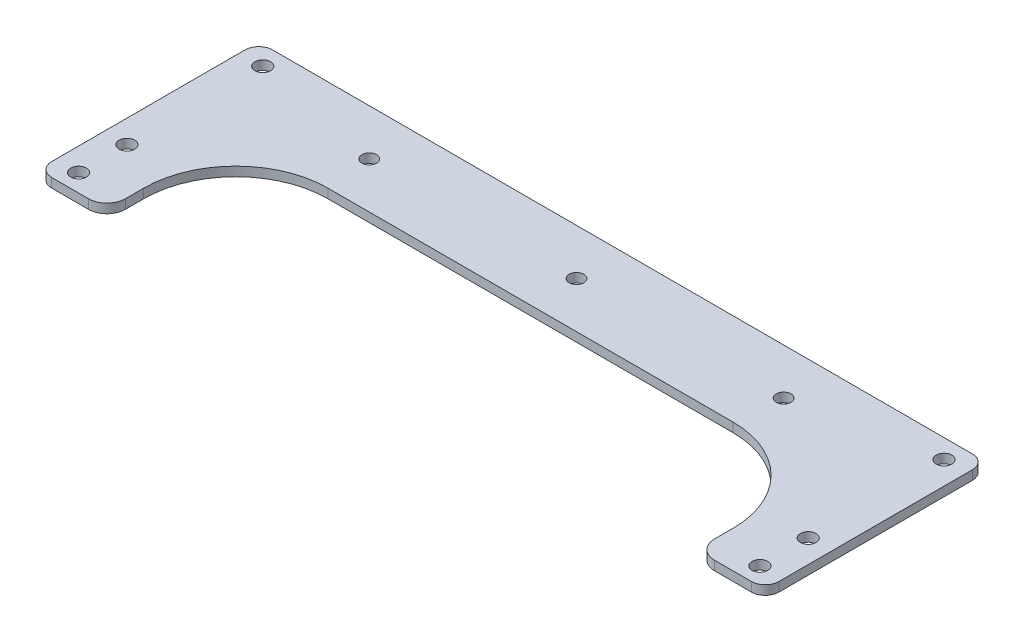
ISO-10303-21;
HEADER;
FILE_DESCRIPTION(('STEP AP214'),'2;1');
FILE_NAME('part.step','',(''),(''),'','','');
FILE_SCHEMA(('AUTOMOTIVE_DESIGN { 1 0 10303 214 1 1 1 1 }'));
ENDSEC;
DATA;
#1=APPLICATION_CONTEXT('core data for automotive mechanical design processes');
#2=APPLICATION_PROTOCOL_DEFINITION('international standard','automotive_design',2000,#1);
#3=PRODUCT_CONTEXT('',#1,'mechanical');
#4=PRODUCT('Part','Part','',(#3));
#5=PRODUCT_RELATED_PRODUCT_CATEGORY('part','',(#4));
#6=PRODUCT_DEFINITION_FORMATION('','',#4);
#7=PRODUCT_DEFINITION_CONTEXT('part definition',#1,'design');
#8=PRODUCT_DEFINITION('design','',#6,#7);
#9=PRODUCT_DEFINITION_SHAPE('','',#8);
#10=(LENGTH_UNIT() NAMED_UNIT(*) SI_UNIT(.MILLI.,.METRE.));
#11=(NAMED_UNIT(*) PLANE_ANGLE_UNIT() SI_UNIT($,.RADIAN.));
#12=(NAMED_UNIT(*) SI_UNIT($,.STERADIAN.) SOLID_ANGLE_UNIT());
#13=UNCERTAINTY_MEASURE_WITH_UNIT(LENGTH_MEASURE(1.E-05),#10,'distance_accuracy_value','');
#14=(GEOMETRIC_REPRESENTATION_CONTEXT(3) GLOBAL_UNCERTAINTY_ASSIGNED_CONTEXT((#13)) GLOBAL_UNIT_ASSIGNED_CONTEXT((#10,
#11,#12)) REPRESENTATION_CONTEXT('',''));
#15=CARTESIAN_POINT('',(0.,0.,0.));
#16=DIRECTION('',(0.,0.,1.));
#17=DIRECTION('',(1.,0.,0.));
#18=AXIS2_PLACEMENT_3D('',#15,#16,#17);
#19=CARTESIAN_POINT('',(0.,2.,0.));
#20=DIRECTION('',(0.,-1.,0.));
#21=DIRECTION('',(0.,0.,-1.));
#22=AXIS2_PLACEMENT_3D('',#19,#20,#21);
#23=PLANE('',#22);
#24=CARTESIAN_POINT('',(45.,2.,-14.));
#25=DIRECTION('',(0.,1.,0.));
#26=DIRECTION('',(0.,0.,1.));
#27=AXIS2_PLACEMENT_3D('',#24,#25,#26);
#28=CIRCLE('',#27,1.6);
#29=CARTESIAN_POINT('',(45.,2.,-12.4));
#30=VERTEX_POINT('',#29);
#31=EDGE_CURVE('E362',#30,#30,#28,.T.);
#32=ORIENTED_EDGE('',*,*,#31,.F.);
#33=EDGE_LOOP('',(#32));
#34=FACE_BOUND('',#33,.T.);
#35=CARTESIAN_POINT('',(-45.,2.,-14.));
#36=DIRECTION('',(0.,1.,0.));
#37=DIRECTION('',(0.,0.,1.));
#38=AXIS2_PLACEMENT_3D('',#35,#36,#37);
#39=CIRCLE('',#38,1.6);
#40=CARTESIAN_POINT('',(-45.,2.,-12.4));
#41=VERTEX_POINT('',#40);
#42=EDGE_CURVE('E356',#41,#41,#39,.T.);
#43=ORIENTED_EDGE('',*,*,#42,.F.);
#44=EDGE_LOOP('',(#43));
#45=FACE_BOUND('',#44,.T.);
#46=CARTESIAN_POINT('',(0.,2.,-14.));
#47=DIRECTION('',(0.,1.,0.));
#48=DIRECTION('',(0.,0.,1.));
#49=AXIS2_PLACEMENT_3D('',#46,#47,#48);
#50=CIRCLE('',#49,1.6);
#51=CARTESIAN_POINT('',(0.,2.,-12.4));
#52=VERTEX_POINT('',#51);
#53=EDGE_CURVE('E353',#52,#52,#50,.T.);
#54=ORIENTED_EDGE('',*,*,#53,.F.);
#55=EDGE_LOOP('',(#54));
#56=FACE_BOUND('',#55,.T.);
#57=CARTESIAN_POINT('',(-74.,2.,-19.85));
#58=DIRECTION('',(0.,1.,0.));
#59=DIRECTION('',(0.,0.,1.));
#60=AXIS2_PLACEMENT_3D('',#57,#58,#59);
#61=CIRCLE('',#60,1.7);
#62=CARTESIAN_POINT('',(-74.,2.,-18.15));
#63=VERTEX_POINT('',#62);
#64=EDGE_CURVE('E345',#63,#63,#61,.T.);
#65=ORIENTED_EDGE('',*,*,#64,.F.);
#66=EDGE_LOOP('',(#65));
#67=FACE_BOUND('',#66,.T.);
#68=CARTESIAN_POINT('',(-74.,2.,9.64999999999999));
#69=DIRECTION('',(0.,1.,0.));
#70=DIRECTION('',(0.,0.,1.));
#71=AXIS2_PLACEMENT_3D('',#68,#69,#70);
#72=CIRCLE('',#71,1.7);
#73=CARTESIAN_POINT('',(-74.,2.,11.35));
#74=VERTEX_POINT('',#73);
#75=EDGE_CURVE('E320',#74,#74,#72,.T.);
#76=ORIENTED_EDGE('',*,*,#75,.F.);
#77=EDGE_LOOP('',(#76));
#78=FACE_BOUND('',#77,.T.);
#79=CARTESIAN_POINT('',(-74.,2.,20.15));
#80=DIRECTION('',(0.,1.,0.));
#81=DIRECTION('',(0.,0.,1.));
#82=AXIS2_PLACEMENT_3D('',#79,#80,#81);
#83=CIRCLE('',#82,1.7);
#84=CARTESIAN_POINT('',(-74.,2.,21.85));
#85=VERTEX_POINT('',#84);
#86=EDGE_CURVE('E317',#85,#85,#83,.T.);
#87=ORIENTED_EDGE('',*,*,#86,.F.);
#88=EDGE_LOOP('',(#87));
#89=FACE_BOUND('',#88,.T.);
#90=DIRECTION('',(0.,0.,-1.));
#91=VECTOR('',#90,1.);
#92=CARTESIAN_POINT('',(64.,2.,0.));
#93=LINE('',#92,#91);
#94=CARTESIAN_POINT('',(64.,2.,20.));
#95=VERTEX_POINT('',#94);
#96=CARTESIAN_POINT('',(64.,2.,16.));
#97=VERTEX_POINT('',#96);
#98=EDGE_CURVE('E281',#95,#97,#93,.T.);
#99=ORIENTED_EDGE('',*,*,#98,.F.);
#100=CARTESIAN_POINT('',(68.,2.,20.));
#101=DIRECTION('',(0.,-1.,0.));
#102=DIRECTION('',(0.,0.,-1.));
#103=AXIS2_PLACEMENT_3D('',#100,#101,#102);
#104=CIRCLE('',#103,4.);
#105=CARTESIAN_POINT('',(68.,2.,24.));
#106=VERTEX_POINT('',#105);
#107=EDGE_CURVE('E232',#95,#106,#104,.F.);
#108=ORIENTED_EDGE('',*,*,#107,.T.);
#109=DIRECTION('',(1.,0.,0.));
#110=VECTOR('',#109,1.);
#111=CARTESIAN_POINT('',(-79.,2.,24.));
#112=LINE('',#111,#110);
#113=CARTESIAN_POINT('',(76.,2.,24.));
#114=VERTEX_POINT('',#113);
#115=EDGE_CURVE('E293',#106,#114,#112,.T.);
#116=ORIENTED_EDGE('',*,*,#115,.T.);
#117=CARTESIAN_POINT('',(76.,2.,21.));
#118=DIRECTION('',(0.,-1.,0.));
#119=DIRECTION('',(0.,0.,-1.));
#120=AXIS2_PLACEMENT_3D('',#117,#118,#119);
#121=CIRCLE('',#120,3.);
#122=CARTESIAN_POINT('',(79.,2.,21.));
#123=VERTEX_POINT('',#122);
#124=EDGE_CURVE('E212',#114,#123,#121,.F.);
#125=ORIENTED_EDGE('',*,*,#124,.T.);
#126=DIRECTION('',(0.,0.,-1.));
#127=VECTOR('',#126,1.);
#128=CARTESIAN_POINT('',(79.,2.,24.));
#129=LINE('',#128,#127);
#130=CARTESIAN_POINT('',(79.,2.,-21.));
#131=VERTEX_POINT('',#130);
#132=EDGE_CURVE('E198',#123,#131,#129,.T.);
#133=ORIENTED_EDGE('',*,*,#132,.T.);
#134=CARTESIAN_POINT('',(76.,2.,-21.));
#135=DIRECTION('',(0.,-1.,0.));
#136=DIRECTION('',(0.,0.,-1.));
#137=AXIS2_PLACEMENT_3D('',#134,#135,#136);
#138=CIRCLE('',#137,3.);
#139=CARTESIAN_POINT('',(76.,2.,-24.));
#140=VERTEX_POINT('',#139);
#141=EDGE_CURVE('E214',#131,#140,#138,.F.);
#142=ORIENTED_EDGE('',*,*,#141,.T.);
#143=DIRECTION('',(-1.,0.,0.));
#144=VECTOR('',#143,1.);
#145=CARTESIAN_POINT('',(-79.,2.,-24.));
#146=LINE('',#145,#144);
#147=CARTESIAN_POINT('',(-76.,2.,-24.));
#148=VERTEX_POINT('',#147);
#149=EDGE_CURVE('E176',#140,#148,#146,.T.);
#150=ORIENTED_EDGE('',*,*,#149,.T.);
#151=CARTESIAN_POINT('',(-76.,2.,-21.));
#152=DIRECTION('',(0.,-1.,0.));
#153=DIRECTION('',(0.,0.,-1.));
#154=AXIS2_PLACEMENT_3D('',#151,#152,#153);
#155=CIRCLE('',#154,3.);
#156=CARTESIAN_POINT('',(-79.,2.,-21.));
#157=VERTEX_POINT('',#156);
#158=EDGE_CURVE('E210',#148,#157,#155,.F.);
#159=ORIENTED_EDGE('',*,*,#158,.T.);
#160=DIRECTION('',(0.,0.,1.));
#161=VECTOR('',#160,1.);
#162=CARTESIAN_POINT('',(-79.,2.,24.));
#163=LINE('',#162,#161);
#164=CARTESIAN_POINT('',(-79.,2.,21.));
#165=VERTEX_POINT('',#164);
#166=EDGE_CURVE('E291',#157,#165,#163,.T.);
#167=ORIENTED_EDGE('',*,*,#166,.T.);
#168=CARTESIAN_POINT('',(-76.,2.,21.));
#169=DIRECTION('',(0.,-1.,0.));
#170=DIRECTION('',(0.,0.,-1.));
#171=AXIS2_PLACEMENT_3D('',#168,#169,#170);
#172=CIRCLE('',#171,3.);
#173=CARTESIAN_POINT('',(-76.,2.,24.));
#174=VERTEX_POINT('',#173);
#175=EDGE_CURVE('E208',#165,#174,#172,.F.);
#176=ORIENTED_EDGE('',*,*,#175,.T.);
#177=CARTESIAN_POINT('',(-68.,2.,24.));
#178=VERTEX_POINT('',#177);
#179=EDGE_CURVE('E199',#174,#178,#112,.T.);
#180=ORIENTED_EDGE('',*,*,#179,.T.);
#181=CARTESIAN_POINT('',(-68.,2.,20.));
#182=DIRECTION('',(0.,-1.,0.));
#183=DIRECTION('',(0.,0.,-1.));
#184=AXIS2_PLACEMENT_3D('',#181,#182,#183);
#185=CIRCLE('',#184,4.);
#186=CARTESIAN_POINT('',(-64.,2.,20.));
#187=VERTEX_POINT('',#186);
#188=EDGE_CURVE('E230',#178,#187,#185,.F.);
#189=ORIENTED_EDGE('',*,*,#188,.T.);
#190=DIRECTION('',(0.,0.,-1.));
#191=VECTOR('',#190,1.);
#192=CARTESIAN_POINT('',(-64.,2.,0.));
#193=LINE('',#192,#191);
#194=CARTESIAN_POINT('',(-64.,2.,16.));
#195=VERTEX_POINT('',#194);
#196=EDGE_CURVE('E277',#187,#195,#193,.T.);
#197=ORIENTED_EDGE('',*,*,#196,.T.);
#198=CARTESIAN_POINT('',(-44.,2.,16.));
#199=DIRECTION('',(0.,-1.,0.));
#200=DIRECTION('',(0.,0.,-1.));
#201=AXIS2_PLACEMENT_3D('',#198,#199,#200);
#202=CIRCLE('',#201,20.);
#203=CARTESIAN_POINT('',(-44.,2.,-4.));
#204=VERTEX_POINT('',#203);
#205=EDGE_CURVE('E254',#195,#204,#202,.T.);
#206=ORIENTED_EDGE('',*,*,#205,.T.);
#207=DIRECTION('',(-1.,0.,0.));
#208=VECTOR('',#207,1.);
#209=CARTESIAN_POINT('',(0.,2.,-3.99999999999999));
#210=LINE('',#209,#208);
#211=CARTESIAN_POINT('',(44.,2.,-3.99999999999999));
#212=VERTEX_POINT('',#211);
#213=EDGE_CURVE('E276',#212,#204,#210,.T.);
#214=ORIENTED_EDGE('',*,*,#213,.F.);
#215=CARTESIAN_POINT('',(44.,2.,16.));
#216=DIRECTION('',(0.,-1.,0.));
#217=DIRECTION('',(0.,0.,-1.));
#218=AXIS2_PLACEMENT_3D('',#215,#216,#217);
#219=CIRCLE('',#218,20.);
#220=EDGE_CURVE('E51',#212,#97,#219,.T.);
#221=ORIENTED_EDGE('',*,*,#220,.T.);
#222=EDGE_LOOP('',(#99,#108,#116,#125,#133,#142,#150,#159,#167,#176,#180,#189,#197,#206,#214,#221));
#223=FACE_BOUND('',#222,.T.);
#224=CARTESIAN_POINT('',(74.,2.,-19.85));
#225=DIRECTION('',(0.,-1.,0.));
#226=DIRECTION('',(0.,0.,-1.));
#227=AXIS2_PLACEMENT_3D('',#224,#225,#226);
#228=CIRCLE('',#227,1.69999999999999);
#229=CARTESIAN_POINT('',(74.,2.,-21.55));
#230=VERTEX_POINT('',#229);
#231=EDGE_CURVE('E339',#230,#230,#228,.T.);
#232=ORIENTED_EDGE('',*,*,#231,.T.);
#233=EDGE_LOOP('',(#232));
#234=FACE_BOUND('',#233,.T.);
#235=CARTESIAN_POINT('',(74.,2.,9.64999999999999));
#236=DIRECTION('',(0.,-1.,0.));
#237=DIRECTION('',(0.,0.,-1.));
#238=AXIS2_PLACEMENT_3D('',#235,#236,#237);
#239=CIRCLE('',#238,1.7);
#240=CARTESIAN_POINT('',(74.,2.,7.94999999999999));
#241=VERTEX_POINT('',#240);
#242=EDGE_CURVE('E333',#241,#241,#239,.T.);
#243=ORIENTED_EDGE('',*,*,#242,.T.);
#244=EDGE_LOOP('',(#243));
#245=FACE_BOUND('',#244,.T.);
#246=CARTESIAN_POINT('',(74.,2.,20.15));
#247=DIRECTION('',(0.,-1.,0.));
#248=DIRECTION('',(0.,0.,-1.));
#249=AXIS2_PLACEMENT_3D('',#246,#247,#248);
#250=CIRCLE('',#249,1.7);
#251=CARTESIAN_POINT('',(74.,2.,18.45));
#252=VERTEX_POINT('',#251);
#253=EDGE_CURVE('E326',#252,#252,#250,.T.);
#254=ORIENTED_EDGE('',*,*,#253,.T.);
#255=EDGE_LOOP('',(#254));
#256=FACE_BOUND('',#255,.T.);
#257=ADVANCED_FACE('F43',(#34,#45,#56,#67,#78,#89,#223,#234,#245,#256),#23,.F.);
#258=CARTESIAN_POINT('',(0.,0.,0.));
#259=DIRECTION('',(0.,-1.,0.));
#260=DIRECTION('',(0.,0.,-1.));
#261=AXIS2_PLACEMENT_3D('',#258,#259,#260);
#262=PLANE('',#261);
#263=CARTESIAN_POINT('',(45.,0.,-14.));
#264=DIRECTION('',(0.,1.,0.));
#265=DIRECTION('',(0.,0.,1.));
#266=AXIS2_PLACEMENT_3D('',#263,#264,#265);
#267=CIRCLE('',#266,1.6);
#268=CARTESIAN_POINT('',(45.,0.,-12.4));
#269=VERTEX_POINT('',#268);
#270=EDGE_CURVE('E359',#269,#269,#267,.T.);
#271=ORIENTED_EDGE('',*,*,#270,.T.);
#272=EDGE_LOOP('',(#271));
#273=FACE_BOUND('',#272,.T.);
#274=CARTESIAN_POINT('',(-45.,0.,-14.));
#275=DIRECTION('',(0.,1.,0.));
#276=DIRECTION('',(0.,0.,1.));
#277=AXIS2_PLACEMENT_3D('',#274,#275,#276);
#278=CIRCLE('',#277,1.6);
#279=CARTESIAN_POINT('',(-45.,0.,-12.4));
#280=VERTEX_POINT('',#279);
#281=EDGE_CURVE('E365',#280,#280,#278,.T.);
#282=ORIENTED_EDGE('',*,*,#281,.T.);
#283=EDGE_LOOP('',(#282));
#284=FACE_BOUND('',#283,.T.);
#285=CARTESIAN_POINT('',(0.,0.,-14.));
#286=DIRECTION('',(0.,1.,0.));
#287=DIRECTION('',(0.,0.,1.));
#288=AXIS2_PLACEMENT_3D('',#285,#286,#287);
#289=CIRCLE('',#288,1.6);
#290=CARTESIAN_POINT('',(0.,0.,-12.4));
#291=VERTEX_POINT('',#290);
#292=EDGE_CURVE('E327',#291,#291,#289,.T.);
#293=ORIENTED_EDGE('',*,*,#292,.T.);
#294=EDGE_LOOP('',(#293));
#295=FACE_BOUND('',#294,.T.);
#296=CARTESIAN_POINT('',(74.,0.,9.64999999999999));
#297=DIRECTION('',(0.,-1.,0.));
#298=DIRECTION('',(0.,0.,-1.));
#299=AXIS2_PLACEMENT_3D('',#296,#297,#298);
#300=CIRCLE('',#299,1.7);
#301=CARTESIAN_POINT('',(74.,0.,7.94999999999999));
#302=VERTEX_POINT('',#301);
#303=EDGE_CURVE('E330',#302,#302,#300,.T.);
#304=ORIENTED_EDGE('',*,*,#303,.F.);
#305=EDGE_LOOP('',(#304));
#306=FACE_BOUND('',#305,.T.);
#307=DIRECTION('',(1.,0.,0.));
#308=VECTOR('',#307,1.);
#309=CARTESIAN_POINT('',(-79.,0.,24.));
#310=LINE('',#309,#308);
#311=CARTESIAN_POINT('',(68.,0.,24.));
#312=VERTEX_POINT('',#311);
#313=CARTESIAN_POINT('',(76.,0.,24.));
#314=VERTEX_POINT('',#313);
#315=EDGE_CURVE('E189',#312,#314,#310,.T.);
#316=ORIENTED_EDGE('',*,*,#315,.F.);
#317=CARTESIAN_POINT('',(68.,0.,20.));
#318=DIRECTION('',(0.,-1.,0.));
#319=DIRECTION('',(0.,0.,-1.));
#320=AXIS2_PLACEMENT_3D('',#317,#318,#319);
#321=CIRCLE('',#320,4.);
#322=CARTESIAN_POINT('',(64.,0.,20.));
#323=VERTEX_POINT('',#322);
#324=EDGE_CURVE('E238',#312,#323,#321,.T.);
#325=ORIENTED_EDGE('',*,*,#324,.T.);
#326=DIRECTION('',(0.,0.,-1.));
#327=VECTOR('',#326,1.);
#328=CARTESIAN_POINT('',(64.,0.,0.));
#329=LINE('',#328,#327);
#330=CARTESIAN_POINT('',(64.,0.,16.));
#331=VERTEX_POINT('',#330);
#332=EDGE_CURVE('E283',#323,#331,#329,.T.);
#333=ORIENTED_EDGE('',*,*,#332,.T.);
#334=CARTESIAN_POINT('',(44.,0.,16.));
#335=DIRECTION('',(0.,-1.,0.));
#336=DIRECTION('',(0.,0.,-1.));
#337=AXIS2_PLACEMENT_3D('',#334,#335,#336);
#338=CIRCLE('',#337,20.);
#339=CARTESIAN_POINT('',(44.,0.,-3.99999999999999));
#340=VERTEX_POINT('',#339);
#341=EDGE_CURVE('E11',#331,#340,#338,.F.);
#342=ORIENTED_EDGE('',*,*,#341,.T.);
#343=DIRECTION('',(-1.,0.,0.));
#344=VECTOR('',#343,1.);
#345=CARTESIAN_POINT('',(0.,0.,-3.99999999999999));
#346=LINE('',#345,#344);
#347=CARTESIAN_POINT('',(-44.,0.,-4.));
#348=VERTEX_POINT('',#347);
#349=EDGE_CURVE('E263',#340,#348,#346,.T.);
#350=ORIENTED_EDGE('',*,*,#349,.T.);
#351=CARTESIAN_POINT('',(-44.,0.,16.));
#352=DIRECTION('',(0.,-1.,0.));
#353=DIRECTION('',(0.,0.,-1.));
#354=AXIS2_PLACEMENT_3D('',#351,#352,#353);
#355=CIRCLE('',#354,20.);
#356=CARTESIAN_POINT('',(-64.,0.,16.));
#357=VERTEX_POINT('',#356);
#358=EDGE_CURVE('E256',#348,#357,#355,.F.);
#359=ORIENTED_EDGE('',*,*,#358,.T.);
#360=DIRECTION('',(0.,0.,-1.));
#361=VECTOR('',#360,1.);
#362=CARTESIAN_POINT('',(-64.,0.,0.));
#363=LINE('',#362,#361);
#364=CARTESIAN_POINT('',(-64.,0.,20.));
#365=VERTEX_POINT('',#364);
#366=EDGE_CURVE('E191',#365,#357,#363,.T.);
#367=ORIENTED_EDGE('',*,*,#366,.F.);
#368=CARTESIAN_POINT('',(-68.,0.,20.));
#369=DIRECTION('',(0.,-1.,0.));
#370=DIRECTION('',(0.,0.,-1.));
#371=AXIS2_PLACEMENT_3D('',#368,#369,#370);
#372=CIRCLE('',#371,4.);
#373=CARTESIAN_POINT('',(-68.,0.,24.));
#374=VERTEX_POINT('',#373);
#375=EDGE_CURVE('E236',#365,#374,#372,.T.);
#376=ORIENTED_EDGE('',*,*,#375,.T.);
#377=CARTESIAN_POINT('',(-76.,0.,24.));
#378=VERTEX_POINT('',#377);
#379=EDGE_CURVE('E195',#378,#374,#310,.T.);
#380=ORIENTED_EDGE('',*,*,#379,.F.);
#381=CARTESIAN_POINT('',(-76.,0.,21.));
#382=DIRECTION('',(0.,-1.,0.));
#383=DIRECTION('',(0.,0.,-1.));
#384=AXIS2_PLACEMENT_3D('',#381,#382,#383);
#385=CIRCLE('',#384,3.);
#386=CARTESIAN_POINT('',(-79.,0.,21.));
#387=VERTEX_POINT('',#386);
#388=EDGE_CURVE('E177',#378,#387,#385,.T.);
#389=ORIENTED_EDGE('',*,*,#388,.T.);
#390=DIRECTION('',(0.,0.,1.));
#391=VECTOR('',#390,1.);
#392=CARTESIAN_POINT('',(-79.,0.,24.));
#393=LINE('',#392,#391);
#394=CARTESIAN_POINT('',(-79.,0.,-21.));
#395=VERTEX_POINT('',#394);
#396=EDGE_CURVE('E185',#395,#387,#393,.T.);
#397=ORIENTED_EDGE('',*,*,#396,.F.);
#398=CARTESIAN_POINT('',(-76.,0.,-21.));
#399=DIRECTION('',(0.,-1.,0.));
#400=DIRECTION('',(0.,0.,-1.));
#401=AXIS2_PLACEMENT_3D('',#398,#399,#400);
#402=CIRCLE('',#401,3.);
#403=CARTESIAN_POINT('',(-76.,0.,-24.));
#404=VERTEX_POINT('',#403);
#405=EDGE_CURVE('E184',#395,#404,#402,.T.);
#406=ORIENTED_EDGE('',*,*,#405,.T.);
#407=DIRECTION('',(-1.,0.,0.));
#408=VECTOR('',#407,1.);
#409=CARTESIAN_POINT('',(-79.,0.,-24.));
#410=LINE('',#409,#408);
#411=CARTESIAN_POINT('',(76.,0.,-24.));
#412=VERTEX_POINT('',#411);
#413=EDGE_CURVE('E173',#412,#404,#410,.T.);
#414=ORIENTED_EDGE('',*,*,#413,.F.);
#415=CARTESIAN_POINT('',(76.,0.,-21.));
#416=DIRECTION('',(0.,-1.,0.));
#417=DIRECTION('',(0.,0.,-1.));
#418=AXIS2_PLACEMENT_3D('',#415,#416,#417);
#419=CIRCLE('',#418,3.);
#420=CARTESIAN_POINT('',(79.,0.,-21.));
#421=VERTEX_POINT('',#420);
#422=EDGE_CURVE('E156',#412,#421,#419,.T.);
#423=ORIENTED_EDGE('',*,*,#422,.T.);
#424=DIRECTION('',(0.,0.,-1.));
#425=VECTOR('',#424,1.);
#426=CARTESIAN_POINT('',(79.,0.,24.));
#427=LINE('',#426,#425);
#428=CARTESIAN_POINT('',(79.,0.,21.));
#429=VERTEX_POINT('',#428);
#430=EDGE_CURVE('E186',#429,#421,#427,.T.);
#431=ORIENTED_EDGE('',*,*,#430,.F.);
#432=CARTESIAN_POINT('',(76.,0.,21.));
#433=DIRECTION('',(0.,-1.,0.));
#434=DIRECTION('',(0.,0.,-1.));
#435=AXIS2_PLACEMENT_3D('',#432,#433,#434);
#436=CIRCLE('',#435,3.);
#437=EDGE_CURVE('E167',#429,#314,#436,.T.);
#438=ORIENTED_EDGE('',*,*,#437,.T.);
#439=EDGE_LOOP('',(#316,#325,#333,#342,#350,#359,#367,#376,#380,#389,#397,#406,#414,#423,#431,#438));
#440=FACE_BOUND('',#439,.T.);
#441=CARTESIAN_POINT('',(-74.,0.,20.15));
#442=DIRECTION('',(0.,1.,0.));
#443=DIRECTION('',(0.,0.,1.));
#444=AXIS2_PLACEMENT_3D('',#441,#442,#443);
#445=CIRCLE('',#444,1.7);
#446=CARTESIAN_POINT('',(-74.,0.,21.85));
#447=VERTEX_POINT('',#446);
#448=EDGE_CURVE('E285',#447,#447,#445,.T.);
#449=ORIENTED_EDGE('',*,*,#448,.T.);
#450=EDGE_LOOP('',(#449));
#451=FACE_BOUND('',#450,.T.);
#452=CARTESIAN_POINT('',(-74.,0.,9.64999999999999));
#453=DIRECTION('',(0.,1.,0.));
#454=DIRECTION('',(0.,0.,1.));
#455=AXIS2_PLACEMENT_3D('',#452,#453,#454);
#456=CIRCLE('',#455,1.7);
#457=CARTESIAN_POINT('',(-74.,0.,11.35));
#458=VERTEX_POINT('',#457);
#459=EDGE_CURVE('E348',#458,#458,#456,.T.);
#460=ORIENTED_EDGE('',*,*,#459,.T.);
#461=EDGE_LOOP('',(#460));
#462=FACE_BOUND('',#461,.T.);
#463=CARTESIAN_POINT('',(-74.,0.,-19.85));
#464=DIRECTION('',(0.,1.,0.));
#465=DIRECTION('',(0.,0.,1.));
#466=AXIS2_PLACEMENT_3D('',#463,#464,#465);
#467=CIRCLE('',#466,1.7);
#468=CARTESIAN_POINT('',(-74.,0.,-18.15));
#469=VERTEX_POINT('',#468);
#470=EDGE_CURVE('E342',#469,#469,#467,.T.);
#471=ORIENTED_EDGE('',*,*,#470,.T.);
#472=EDGE_LOOP('',(#471));
#473=FACE_BOUND('',#472,.T.);
#474=CARTESIAN_POINT('',(74.,0.,-19.85));
#475=DIRECTION('',(0.,-1.,0.));
#476=DIRECTION('',(0.,0.,-1.));
#477=AXIS2_PLACEMENT_3D('',#474,#475,#476);
#478=CIRCLE('',#477,1.69999999999999);
#479=CARTESIAN_POINT('',(74.,0.,-21.55));
#480=VERTEX_POINT('',#479);
#481=EDGE_CURVE('E336',#480,#480,#478,.T.);
#482=ORIENTED_EDGE('',*,*,#481,.F.);
#483=EDGE_LOOP('',(#482));
#484=FACE_BOUND('',#483,.T.);
#485=CARTESIAN_POINT('',(74.,0.,20.15));
#486=DIRECTION('',(0.,-1.,0.));
#487=DIRECTION('',(0.,0.,-1.));
#488=AXIS2_PLACEMENT_3D('',#485,#486,#487);
#489=CIRCLE('',#488,1.7);
#490=CARTESIAN_POINT('',(74.,0.,18.45));
#491=VERTEX_POINT('',#490);
#492=EDGE_CURVE('E323',#491,#491,#489,.T.);
#493=ORIENTED_EDGE('',*,*,#492,.F.);
#494=EDGE_LOOP('',(#493));
#495=FACE_BOUND('',#494,.T.);
#496=ADVANCED_FACE('F181',(#273,#284,#295,#306,#440,#451,#462,#473,#484,#495),#262,.T.);
#497=CARTESIAN_POINT('',(-79.,2.,24.));
#498=DIRECTION('',(0.,0.,-1.));
#499=DIRECTION('',(-1.,0.,0.));
#500=AXIS2_PLACEMENT_3D('',#497,#498,#499);
#501=PLANE('',#500);
#502=ORIENTED_EDGE('',*,*,#379,.T.);
#503=DIRECTION('',(0.,1.,0.));
#504=VECTOR('',#503,1.);
#505=CARTESIAN_POINT('',(-68.,2.,24.));
#506=LINE('',#505,#504);
#507=EDGE_CURVE('E240',#374,#178,#506,.T.);
#508=ORIENTED_EDGE('',*,*,#507,.T.);
#509=ORIENTED_EDGE('',*,*,#179,.F.);
#510=DIRECTION('',(0.,-1.,0.));
#511=VECTOR('',#510,1.);
#512=CARTESIAN_POINT('',(-76.,2.,24.));
#513=LINE('',#512,#511);
#514=EDGE_CURVE('E224',#174,#378,#513,.T.);
#515=ORIENTED_EDGE('',*,*,#514,.T.);
#516=EDGE_LOOP('',(#502,#508,#509,#515));
#517=FACE_BOUND('',#516,.T.);
#518=ADVANCED_FACE('F409',(#517),#501,.F.);
#519=CARTESIAN_POINT('',(79.,2.,24.));
#520=DIRECTION('',(-1.,0.,0.));
#521=DIRECTION('',(0.,0.,1.));
#522=AXIS2_PLACEMENT_3D('',#519,#520,#521);
#523=PLANE('',#522);
#524=ORIENTED_EDGE('',*,*,#430,.T.);
#525=DIRECTION('',(0.,-1.,0.));
#526=VECTOR('',#525,1.);
#527=CARTESIAN_POINT('',(79.,2.,-21.));
#528=LINE('',#527,#526);
#529=EDGE_CURVE('E161',#421,#131,#528,.F.);
#530=ORIENTED_EDGE('',*,*,#529,.T.);
#531=ORIENTED_EDGE('',*,*,#132,.F.);
#532=DIRECTION('',(0.,-1.,0.));
#533=VECTOR('',#532,1.);
#534=CARTESIAN_POINT('',(79.,2.,21.));
#535=LINE('',#534,#533);
#536=EDGE_CURVE('E166',#123,#429,#535,.T.);
#537=ORIENTED_EDGE('',*,*,#536,.T.);
#538=EDGE_LOOP('',(#524,#530,#531,#537));
#539=FACE_BOUND('',#538,.T.);
#540=ADVANCED_FACE('F307',(#539),#523,.F.);
#541=CARTESIAN_POINT('',(-79.,2.,-24.));
#542=DIRECTION('',(0.,0.,1.));
#543=DIRECTION('',(1.,0.,0.));
#544=AXIS2_PLACEMENT_3D('',#541,#542,#543);
#545=PLANE('',#544);
#546=ORIENTED_EDGE('',*,*,#149,.F.);
#547=DIRECTION('',(0.,-1.,0.));
#548=VECTOR('',#547,1.);
#549=CARTESIAN_POINT('',(76.,2.,-24.));
#550=LINE('',#549,#548);
#551=EDGE_CURVE('E160',#140,#412,#550,.T.);
#552=ORIENTED_EDGE('',*,*,#551,.T.);
#553=ORIENTED_EDGE('',*,*,#413,.T.);
#554=DIRECTION('',(0.,-1.,0.));
#555=VECTOR('',#554,1.);
#556=CARTESIAN_POINT('',(-76.,2.,-24.));
#557=LINE('',#556,#555);
#558=EDGE_CURVE('E178',#404,#148,#557,.F.);
#559=ORIENTED_EDGE('',*,*,#558,.T.);
#560=EDGE_LOOP('',(#546,#552,#553,#559));
#561=FACE_BOUND('',#560,.T.);
#562=ADVANCED_FACE('F172',(#561),#545,.F.);
#563=CARTESIAN_POINT('',(-79.,2.,24.));
#564=DIRECTION('',(1.,0.,0.));
#565=DIRECTION('',(0.,0.,-1.));
#566=AXIS2_PLACEMENT_3D('',#563,#564,#565);
#567=PLANE('',#566);
#568=ORIENTED_EDGE('',*,*,#166,.F.);
#569=DIRECTION('',(0.,-1.,0.));
#570=VECTOR('',#569,1.);
#571=CARTESIAN_POINT('',(-79.,2.,-21.));
#572=LINE('',#571,#570);
#573=EDGE_CURVE('E221',#157,#395,#572,.T.);
#574=ORIENTED_EDGE('',*,*,#573,.T.);
#575=ORIENTED_EDGE('',*,*,#396,.T.);
#576=DIRECTION('',(0.,-1.,0.));
#577=VECTOR('',#576,1.);
#578=CARTESIAN_POINT('',(-79.,2.,21.));
#579=LINE('',#578,#577);
#580=EDGE_CURVE('E219',#387,#165,#579,.F.);
#581=ORIENTED_EDGE('',*,*,#580,.T.);
#582=EDGE_LOOP('',(#568,#574,#575,#581));
#583=FACE_BOUND('',#582,.T.);
#584=ADVANCED_FACE('F413',(#583),#567,.F.);
#585=ORIENTED_EDGE('',*,*,#115,.F.);
#586=DIRECTION('',(0.,1.,0.));
#587=VECTOR('',#586,1.);
#588=CARTESIAN_POINT('',(68.,2.,24.));
#589=LINE('',#588,#587);
#590=EDGE_CURVE('E234',#106,#312,#589,.F.);
#591=ORIENTED_EDGE('',*,*,#590,.T.);
#592=ORIENTED_EDGE('',*,*,#315,.T.);
#593=DIRECTION('',(0.,-1.,0.));
#594=VECTOR('',#593,1.);
#595=CARTESIAN_POINT('',(76.,2.,24.));
#596=LINE('',#595,#594);
#597=EDGE_CURVE('E216',#314,#114,#596,.F.);
#598=ORIENTED_EDGE('',*,*,#597,.T.);
#599=EDGE_LOOP('',(#585,#591,#592,#598));
#600=FACE_BOUND('',#599,.T.);
#601=ADVANCED_FACE('F302',(#600),#501,.F.);
#602=CARTESIAN_POINT('',(64.,0.,0.));
#603=DIRECTION('',(1.,0.,0.));
#604=DIRECTION('',(0.,0.,-1.));
#605=AXIS2_PLACEMENT_3D('',#602,#603,#604);
#606=PLANE('',#605);
#607=ORIENTED_EDGE('',*,*,#98,.T.);
#608=DIRECTION('',(0.,1.,0.));
#609=VECTOR('',#608,1.);
#610=CARTESIAN_POINT('',(64.,0.,16.));
#611=LINE('',#610,#609);
#612=EDGE_CURVE('E64',#97,#331,#611,.F.);
#613=ORIENTED_EDGE('',*,*,#612,.T.);
#614=ORIENTED_EDGE('',*,*,#332,.F.);
#615=DIRECTION('',(0.,1.,0.));
#616=VECTOR('',#615,1.);
#617=CARTESIAN_POINT('',(64.,0.,20.));
#618=LINE('',#617,#616);
#619=EDGE_CURVE('E227',#323,#95,#618,.T.);
#620=ORIENTED_EDGE('',*,*,#619,.T.);
#621=EDGE_LOOP('',(#607,#613,#614,#620));
#622=FACE_BOUND('',#621,.T.);
#623=ADVANCED_FACE('F312',(#622),#606,.F.);
#624=CARTESIAN_POINT('',(-64.,0.,0.));
#625=DIRECTION('',(1.,0.,0.));
#626=DIRECTION('',(0.,0.,-1.));
#627=AXIS2_PLACEMENT_3D('',#624,#625,#626);
#628=PLANE('',#627);
#629=ORIENTED_EDGE('',*,*,#366,.T.);
#630=DIRECTION('',(0.,1.,0.));
#631=VECTOR('',#630,1.);
#632=CARTESIAN_POINT('',(-64.,0.,16.));
#633=LINE('',#632,#631);
#634=EDGE_CURVE('E245',#357,#195,#633,.T.);
#635=ORIENTED_EDGE('',*,*,#634,.T.);
#636=ORIENTED_EDGE('',*,*,#196,.F.);
#637=DIRECTION('',(0.,1.,0.));
#638=VECTOR('',#637,1.);
#639=CARTESIAN_POINT('',(-64.,0.,20.));
#640=LINE('',#639,#638);
#641=EDGE_CURVE('E243',#187,#365,#640,.F.);
#642=ORIENTED_EDGE('',*,*,#641,.T.);
#643=EDGE_LOOP('',(#629,#635,#636,#642));
#644=FACE_BOUND('',#643,.T.);
#645=ADVANCED_FACE('F268',(#644),#628,.T.);
#646=CARTESIAN_POINT('',(0.,0.,-3.99999999999999));
#647=DIRECTION('',(0.,0.,-1.));
#648=DIRECTION('',(-1.,0.,0.));
#649=AXIS2_PLACEMENT_3D('',#646,#647,#648);
#650=PLANE('',#649);
#651=ORIENTED_EDGE('',*,*,#213,.T.);
#652=DIRECTION('',(0.,1.,0.));
#653=VECTOR('',#652,1.);
#654=CARTESIAN_POINT('',(-44.,0.,-4.));
#655=LINE('',#654,#653);
#656=EDGE_CURVE('E251',#204,#348,#655,.F.);
#657=ORIENTED_EDGE('',*,*,#656,.T.);
#658=ORIENTED_EDGE('',*,*,#349,.F.);
#659=DIRECTION('',(0.,1.,0.));
#660=VECTOR('',#659,1.);
#661=CARTESIAN_POINT('',(44.,2.,-3.99999999999999));
#662=LINE('',#661,#660);
#663=EDGE_CURVE('E248',#340,#212,#662,.T.);
#664=ORIENTED_EDGE('',*,*,#663,.T.);
#665=EDGE_LOOP('',(#651,#657,#658,#664));
#666=FACE_BOUND('',#665,.T.);
#667=ADVANCED_FACE('F279',(#666),#650,.F.);
#668=CARTESIAN_POINT('',(-74.,0.,20.15));
#669=DIRECTION('',(0.,1.,0.));
#670=DIRECTION('',(0.,0.,1.));
#671=AXIS2_PLACEMENT_3D('',#668,#669,#670);
#672=CYLINDRICAL_SURFACE('',#671,1.7);
#673=ORIENTED_EDGE('',*,*,#448,.F.);
#674=EDGE_LOOP('',(#673));
#675=FACE_BOUND('',#674,.T.);
#676=ORIENTED_EDGE('',*,*,#86,.T.);
#677=EDGE_LOOP('',(#676));
#678=FACE_BOUND('',#677,.T.);
#679=ADVANCED_FACE('F385',(#675,#678),#672,.F.);
#680=CARTESIAN_POINT('',(-74.,0.,9.64999999999999));
#681=DIRECTION('',(0.,1.,0.));
#682=DIRECTION('',(0.,0.,1.));
#683=AXIS2_PLACEMENT_3D('',#680,#681,#682);
#684=CYLINDRICAL_SURFACE('',#683,1.7);
#685=ORIENTED_EDGE('',*,*,#459,.F.);
#686=EDGE_LOOP('',(#685));
#687=FACE_BOUND('',#686,.T.);
#688=ORIENTED_EDGE('',*,*,#75,.T.);
#689=EDGE_LOOP('',(#688));
#690=FACE_BOUND('',#689,.T.);
#691=ADVANCED_FACE('F387',(#687,#690),#684,.F.);
#692=CARTESIAN_POINT('',(-74.,0.,-19.85));
#693=DIRECTION('',(0.,1.,0.));
#694=DIRECTION('',(0.,0.,1.));
#695=AXIS2_PLACEMENT_3D('',#692,#693,#694);
#696=CYLINDRICAL_SURFACE('',#695,1.7);
#697=ORIENTED_EDGE('',*,*,#470,.F.);
#698=EDGE_LOOP('',(#697));
#699=FACE_BOUND('',#698,.T.);
#700=ORIENTED_EDGE('',*,*,#64,.T.);
#701=EDGE_LOOP('',(#700));
#702=FACE_BOUND('',#701,.T.);
#703=ADVANCED_FACE('F394',(#699,#702),#696,.F.);
#704=CARTESIAN_POINT('',(74.,0.,-19.85));
#705=DIRECTION('',(0.,1.,0.));
#706=DIRECTION('',(0.,0.,1.));
#707=AXIS2_PLACEMENT_3D('',#704,#705,#706);
#708=CYLINDRICAL_SURFACE('',#707,1.69999999999999);
#709=ORIENTED_EDGE('',*,*,#481,.T.);
#710=EDGE_LOOP('',(#709));
#711=FACE_BOUND('',#710,.T.);
#712=ORIENTED_EDGE('',*,*,#231,.F.);
#713=EDGE_LOOP('',(#712));
#714=FACE_BOUND('',#713,.T.);
#715=ADVANCED_FACE('F614',(#711,#714),#708,.F.);
#716=CARTESIAN_POINT('',(74.,0.,9.64999999999999));
#717=DIRECTION('',(0.,1.,0.));
#718=DIRECTION('',(0.,0.,1.));
#719=AXIS2_PLACEMENT_3D('',#716,#717,#718);
#720=CYLINDRICAL_SURFACE('',#719,1.7);
#721=ORIENTED_EDGE('',*,*,#303,.T.);
#722=EDGE_LOOP('',(#721));
#723=FACE_BOUND('',#722,.T.);
#724=ORIENTED_EDGE('',*,*,#242,.F.);
#725=EDGE_LOOP('',(#724));
#726=FACE_BOUND('',#725,.T.);
#727=ADVANCED_FACE('F604',(#723,#726),#720,.F.);
#728=CARTESIAN_POINT('',(74.,0.,20.15));
#729=DIRECTION('',(0.,1.,0.));
#730=DIRECTION('',(0.,0.,1.));
#731=AXIS2_PLACEMENT_3D('',#728,#729,#730);
#732=CYLINDRICAL_SURFACE('',#731,1.7);
#733=ORIENTED_EDGE('',*,*,#492,.T.);
#734=EDGE_LOOP('',(#733));
#735=FACE_BOUND('',#734,.T.);
#736=ORIENTED_EDGE('',*,*,#253,.F.);
#737=EDGE_LOOP('',(#736));
#738=FACE_BOUND('',#737,.T.);
#739=ADVANCED_FACE('F401',(#735,#738),#732,.F.);
#740=CARTESIAN_POINT('',(0.,0.,-14.));
#741=DIRECTION('',(0.,1.,0.));
#742=DIRECTION('',(0.,0.,1.));
#743=AXIS2_PLACEMENT_3D('',#740,#741,#742);
#744=CYLINDRICAL_SURFACE('',#743,1.6);
#745=ORIENTED_EDGE('',*,*,#292,.F.);
#746=EDGE_LOOP('',(#745));
#747=FACE_BOUND('',#746,.T.);
#748=ORIENTED_EDGE('',*,*,#53,.T.);
#749=EDGE_LOOP('',(#748));
#750=FACE_BOUND('',#749,.T.);
#751=ADVANCED_FACE('F583',(#747,#750),#744,.F.);
#752=CARTESIAN_POINT('',(-45.,0.,-14.));
#753=DIRECTION('',(0.,1.,0.));
#754=DIRECTION('',(0.,0.,1.));
#755=AXIS2_PLACEMENT_3D('',#752,#753,#754);
#756=CYLINDRICAL_SURFACE('',#755,1.6);
#757=ORIENTED_EDGE('',*,*,#281,.F.);
#758=EDGE_LOOP('',(#757));
#759=FACE_BOUND('',#758,.T.);
#760=ORIENTED_EDGE('',*,*,#42,.T.);
#761=EDGE_LOOP('',(#760));
#762=FACE_BOUND('',#761,.T.);
#763=ADVANCED_FACE('F371',(#759,#762),#756,.F.);
#764=CARTESIAN_POINT('',(45.,0.,-14.));
#765=DIRECTION('',(0.,1.,0.));
#766=DIRECTION('',(0.,0.,1.));
#767=AXIS2_PLACEMENT_3D('',#764,#765,#766);
#768=CYLINDRICAL_SURFACE('',#767,1.6);
#769=ORIENTED_EDGE('',*,*,#270,.F.);
#770=EDGE_LOOP('',(#769));
#771=FACE_BOUND('',#770,.T.);
#772=ORIENTED_EDGE('',*,*,#31,.T.);
#773=EDGE_LOOP('',(#772));
#774=FACE_BOUND('',#773,.T.);
#775=ADVANCED_FACE('F423',(#771,#774),#768,.F.);
#776=CARTESIAN_POINT('',(76.,2.,-21.));
#777=DIRECTION('',(0.,-1.,0.));
#778=DIRECTION('',(0.,0.,-1.));
#779=AXIS2_PLACEMENT_3D('',#776,#777,#778);
#780=CYLINDRICAL_SURFACE('',#779,3.);
#781=ORIENTED_EDGE('',*,*,#141,.F.);
#782=ORIENTED_EDGE('',*,*,#529,.F.);
#783=ORIENTED_EDGE('',*,*,#422,.F.);
#784=ORIENTED_EDGE('',*,*,#551,.F.);
#785=EDGE_LOOP('',(#781,#782,#783,#784));
#786=FACE_BOUND('',#785,.T.);
#787=ADVANCED_FACE('F159',(#786),#780,.T.);
#788=CARTESIAN_POINT('',(76.,2.,21.));
#789=DIRECTION('',(0.,-1.,0.));
#790=DIRECTION('',(0.,0.,-1.));
#791=AXIS2_PLACEMENT_3D('',#788,#789,#790);
#792=CYLINDRICAL_SURFACE('',#791,3.);
#793=ORIENTED_EDGE('',*,*,#124,.F.);
#794=ORIENTED_EDGE('',*,*,#597,.F.);
#795=ORIENTED_EDGE('',*,*,#437,.F.);
#796=ORIENTED_EDGE('',*,*,#536,.F.);
#797=EDGE_LOOP('',(#793,#794,#795,#796));
#798=FACE_BOUND('',#797,.T.);
#799=ADVANCED_FACE('F305',(#798),#792,.T.);
#800=CARTESIAN_POINT('',(-76.,2.,-21.));
#801=DIRECTION('',(0.,-1.,0.));
#802=DIRECTION('',(0.,0.,-1.));
#803=AXIS2_PLACEMENT_3D('',#800,#801,#802);
#804=CYLINDRICAL_SURFACE('',#803,3.);
#805=ORIENTED_EDGE('',*,*,#158,.F.);
#806=ORIENTED_EDGE('',*,*,#558,.F.);
#807=ORIENTED_EDGE('',*,*,#405,.F.);
#808=ORIENTED_EDGE('',*,*,#573,.F.);
#809=EDGE_LOOP('',(#805,#806,#807,#808));
#810=FACE_BOUND('',#809,.T.);
#811=ADVANCED_FACE('F426',(#810),#804,.T.);
#812=CARTESIAN_POINT('',(-76.,2.,21.));
#813=DIRECTION('',(0.,-1.,0.));
#814=DIRECTION('',(0.,0.,-1.));
#815=AXIS2_PLACEMENT_3D('',#812,#813,#814);
#816=CYLINDRICAL_SURFACE('',#815,3.);
#817=ORIENTED_EDGE('',*,*,#175,.F.);
#818=ORIENTED_EDGE('',*,*,#580,.F.);
#819=ORIENTED_EDGE('',*,*,#388,.F.);
#820=ORIENTED_EDGE('',*,*,#514,.F.);
#821=EDGE_LOOP('',(#817,#818,#819,#820));
#822=FACE_BOUND('',#821,.T.);
#823=ADVANCED_FACE('F429',(#822),#816,.T.);
#824=CARTESIAN_POINT('',(68.,0.,20.));
#825=DIRECTION('',(0.,1.,0.));
#826=DIRECTION('',(0.,0.,1.));
#827=AXIS2_PLACEMENT_3D('',#824,#825,#826);
#828=CYLINDRICAL_SURFACE('',#827,4.);
#829=ORIENTED_EDGE('',*,*,#324,.F.);
#830=ORIENTED_EDGE('',*,*,#590,.F.);
#831=ORIENTED_EDGE('',*,*,#107,.F.);
#832=ORIENTED_EDGE('',*,*,#619,.F.);
#833=EDGE_LOOP('',(#829,#830,#831,#832));
#834=FACE_BOUND('',#833,.T.);
#835=ADVANCED_FACE('F311',(#834),#828,.T.);
#836=CARTESIAN_POINT('',(-68.,2.,20.));
#837=DIRECTION('',(0.,-1.,0.));
#838=DIRECTION('',(0.,0.,-1.));
#839=AXIS2_PLACEMENT_3D('',#836,#837,#838);
#840=CYLINDRICAL_SURFACE('',#839,4.);
#841=ORIENTED_EDGE('',*,*,#375,.F.);
#842=ORIENTED_EDGE('',*,*,#641,.F.);
#843=ORIENTED_EDGE('',*,*,#188,.F.);
#844=ORIENTED_EDGE('',*,*,#507,.F.);
#845=EDGE_LOOP('',(#841,#842,#843,#844));
#846=FACE_BOUND('',#845,.T.);
#847=ADVANCED_FACE('F436',(#846),#840,.T.);
#848=CARTESIAN_POINT('',(-44.,0.,16.));
#849=DIRECTION('',(0.,1.,0.));
#850=DIRECTION('',(0.,0.,1.));
#851=AXIS2_PLACEMENT_3D('',#848,#849,#850);
#852=CYLINDRICAL_SURFACE('',#851,20.);
#853=ORIENTED_EDGE('',*,*,#358,.F.);
#854=ORIENTED_EDGE('',*,*,#656,.F.);
#855=ORIENTED_EDGE('',*,*,#205,.F.);
#856=ORIENTED_EDGE('',*,*,#634,.F.);
#857=EDGE_LOOP('',(#853,#854,#855,#856));
#858=FACE_BOUND('',#857,.T.);
#859=ADVANCED_FACE('F273',(#858),#852,.F.);
#860=CARTESIAN_POINT('',(44.,0.,16.));
#861=DIRECTION('',(0.,-1.,0.));
#862=DIRECTION('',(0.,0.,-1.));
#863=AXIS2_PLACEMENT_3D('',#860,#861,#862);
#864=CYLINDRICAL_SURFACE('',#863,20.);
#865=ORIENTED_EDGE('',*,*,#341,.F.);
#866=ORIENTED_EDGE('',*,*,#612,.F.);
#867=ORIENTED_EDGE('',*,*,#220,.F.);
#868=ORIENTED_EDGE('',*,*,#663,.F.);
#869=EDGE_LOOP('',(#865,#866,#867,#868));
#870=FACE_BOUND('',#869,.T.);
#871=ADVANCED_FACE('F45',(#870),#864,.F.);
#872=CLOSED_SHELL('',(#257,#496,#518,#540,#562,#584,#601,#623,#645,#667,#679,#691,#703,#715,
#727,#739,#751,#763,#775,#787,#799,#811,#823,#835,#847,#859,#871));
#873=MANIFOLD_SOLID_BREP('B2',#872);
#874=ADVANCED_BREP_SHAPE_REPRESENTATION('',(#18,#873),#14);
#875=SHAPE_DEFINITION_REPRESENTATION(#9,#874);
ENDSEC;
END-ISO-10303-21;
